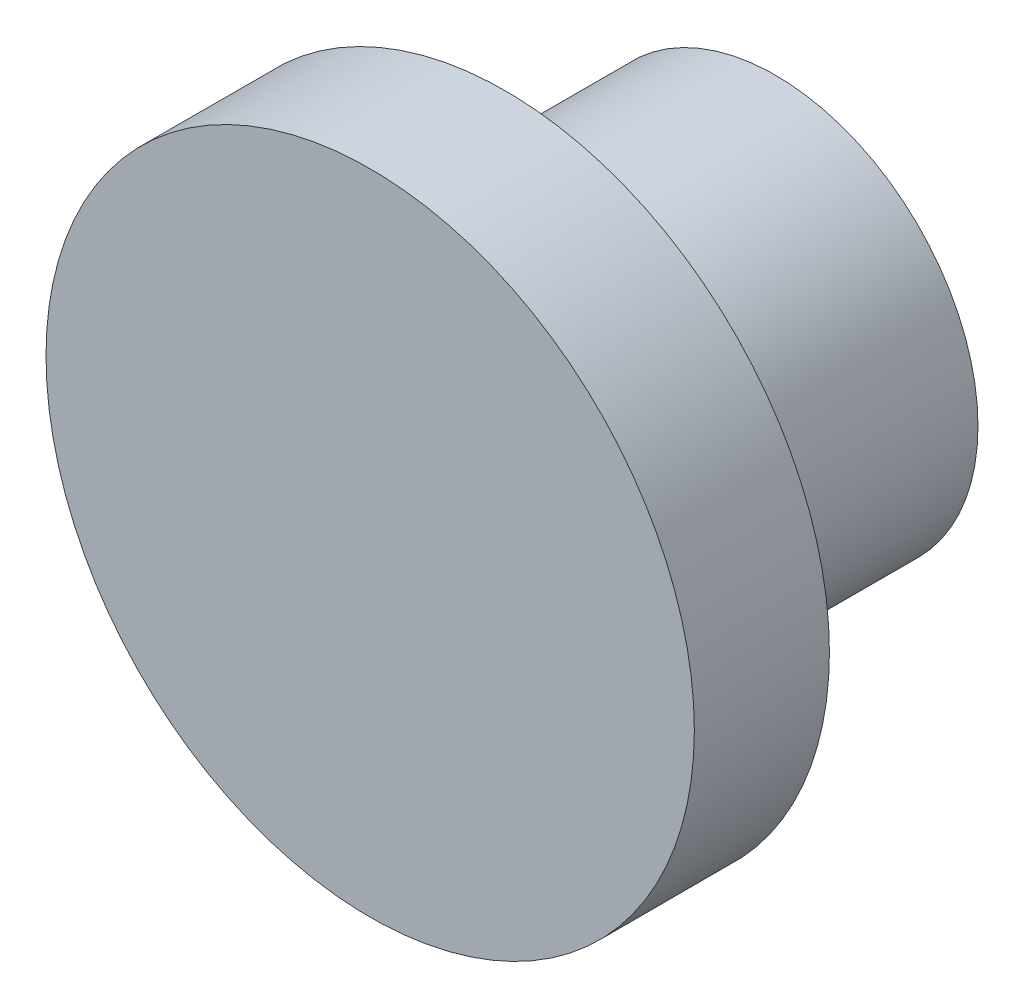
ISO-10303-21;
HEADER;
FILE_DESCRIPTION(('STEP AP214'),'2;1');
FILE_NAME('part.step','',(''),(''),'','','');
FILE_SCHEMA(('AUTOMOTIVE_DESIGN { 1 0 10303 214 1 1 1 1 }'));
ENDSEC;
DATA;
#1=APPLICATION_CONTEXT('core data for automotive mechanical design processes');
#2=APPLICATION_PROTOCOL_DEFINITION('international standard','automotive_design',2000,#1);
#3=PRODUCT_CONTEXT('',#1,'mechanical');
#4=PRODUCT('Part','Part','',(#3));
#5=PRODUCT_RELATED_PRODUCT_CATEGORY('part','',(#4));
#6=PRODUCT_DEFINITION_FORMATION('','',#4);
#7=PRODUCT_DEFINITION_CONTEXT('part definition',#1,'design');
#8=PRODUCT_DEFINITION('design','',#6,#7);
#9=PRODUCT_DEFINITION_SHAPE('','',#8);
#10=(LENGTH_UNIT() NAMED_UNIT(*) SI_UNIT(.MILLI.,.METRE.));
#11=(NAMED_UNIT(*) PLANE_ANGLE_UNIT() SI_UNIT($,.RADIAN.));
#12=(NAMED_UNIT(*) SI_UNIT($,.STERADIAN.) SOLID_ANGLE_UNIT());
#13=UNCERTAINTY_MEASURE_WITH_UNIT(LENGTH_MEASURE(1.E-05),#10,'distance_accuracy_value','');
#14=(GEOMETRIC_REPRESENTATION_CONTEXT(3) GLOBAL_UNCERTAINTY_ASSIGNED_CONTEXT((#13)) GLOBAL_UNIT_ASSIGNED_CONTEXT((#10,
#11,#12)) REPRESENTATION_CONTEXT('',''));
#15=CARTESIAN_POINT('',(0.,0.,0.));
#16=DIRECTION('',(0.,0.,1.));
#17=DIRECTION('',(1.,0.,0.));
#18=AXIS2_PLACEMENT_3D('',#15,#16,#17);
#19=CARTESIAN_POINT('',(0.,30.,92.4264068711929));
#20=DIRECTION('',(0.,0.,-1.));
#21=DIRECTION('',(-1.,0.,0.));
#22=AXIS2_PLACEMENT_3D('',#19,#20,#21);
#23=CYLINDRICAL_SURFACE('',#22,15.);
#24=CARTESIAN_POINT('',(0.,30.,20.));
#25=DIRECTION('',(0.,0.,1.));
#26=DIRECTION('',(1.,0.,0.));
#27=AXIS2_PLACEMENT_3D('',#24,#25,#26);
#28=CIRCLE('',#27,15.);
#29=CARTESIAN_POINT('',(15.,30.,20.));
#30=VERTEX_POINT('',#29);
#31=EDGE_CURVE('E21',#30,#30,#28,.T.);
#32=ORIENTED_EDGE('',*,*,#31,.T.);
#33=EDGE_LOOP('',(#32));
#34=FACE_BOUND('',#33,.T.);
#35=CARTESIAN_POINT('',(0.,30.,40.));
#36=DIRECTION('',(0.,0.,1.));
#37=DIRECTION('',(0.,-1.,0.));
#38=AXIS2_PLACEMENT_3D('',#35,#36,#37);
#39=CIRCLE('',#38,15.);
#40=CARTESIAN_POINT('',(0.,15.,40.));
#41=VERTEX_POINT('',#40);
#42=EDGE_CURVE('E10',#41,#41,#39,.T.);
#43=ORIENTED_EDGE('',*,*,#42,.F.);
#44=EDGE_LOOP('',(#43));
#45=FACE_BOUND('',#44,.T.);
#46=ADVANCED_FACE('F15',(#34,#45),#23,.T.);
#47=CARTESIAN_POINT('',(0.,30.,20.));
#48=DIRECTION('',(0.,0.,1.));
#49=DIRECTION('',(1.,0.,0.));
#50=AXIS2_PLACEMENT_3D('',#47,#48,#49);
#51=PLANE('',#50);
#52=ORIENTED_EDGE('',*,*,#31,.F.);
#53=EDGE_LOOP('',(#52));
#54=FACE_BOUND('',#53,.T.);
#55=ADVANCED_FACE('F40',(#54),#51,.F.);
#56=CARTESIAN_POINT('',(0.,30.,-27.8822509939086));
#57=DIRECTION('',(0.,0.,1.));
#58=DIRECTION('',(1.,0.,0.));
#59=AXIS2_PLACEMENT_3D('',#56,#57,#58);
#60=CYLINDRICAL_SURFACE('',#59,24.);
#61=CARTESIAN_POINT('',(0.,30.,40.));
#62=DIRECTION('',(0.,0.,1.));
#63=DIRECTION('',(0.,-1.,0.));
#64=AXIS2_PLACEMENT_3D('',#61,#62,#63);
#65=CIRCLE('',#64,24.);
#66=CARTESIAN_POINT('',(0.,6.,40.));
#67=VERTEX_POINT('',#66);
#68=EDGE_CURVE('E25',#67,#67,#65,.F.);
#69=ORIENTED_EDGE('',*,*,#68,.F.);
#70=EDGE_LOOP('',(#69));
#71=FACE_BOUND('',#70,.T.);
#72=CARTESIAN_POINT('',(0.,30.,50.));
#73=DIRECTION('',(0.,0.,1.));
#74=DIRECTION('',(1.,0.,0.));
#75=AXIS2_PLACEMENT_3D('',#72,#73,#74);
#76=CIRCLE('',#75,24.);
#77=CARTESIAN_POINT('',(24.,30.,50.));
#78=VERTEX_POINT('',#77);
#79=EDGE_CURVE('E29',#78,#78,#76,.T.);
#80=ORIENTED_EDGE('',*,*,#79,.F.);
#81=EDGE_LOOP('',(#80));
#82=FACE_BOUND('',#81,.T.);
#83=ADVANCED_FACE('F37',(#71,#82),#60,.T.);
#84=CARTESIAN_POINT('',(0.,30.,40.));
#85=DIRECTION('',(0.,0.,1.));
#86=DIRECTION('',(0.,-1.,0.));
#87=AXIS2_PLACEMENT_3D('',#84,#85,#86);
#88=PLANE('',#87);
#89=ORIENTED_EDGE('',*,*,#42,.T.);
#90=EDGE_LOOP('',(#89));
#91=FACE_BOUND('',#90,.T.);
#92=ORIENTED_EDGE('',*,*,#68,.T.);
#93=EDGE_LOOP('',(#92));
#94=FACE_BOUND('',#93,.T.);
#95=ADVANCED_FACE('F39',(#91,#94),#88,.F.);
#96=CARTESIAN_POINT('',(50.,75.,50.));
#97=DIRECTION('',(0.,0.,-1.));
#98=DIRECTION('',(0.,1.,0.));
#99=AXIS2_PLACEMENT_3D('',#96,#97,#98);
#100=PLANE('',#99);
#101=ORIENTED_EDGE('',*,*,#79,.T.);
#102=EDGE_LOOP('',(#101));
#103=FACE_BOUND('',#102,.T.);
#104=ADVANCED_FACE('F35',(#103),#100,.F.);
#105=CLOSED_SHELL('',(#46,#55,#83,#95,#104));
#106=MANIFOLD_SOLID_BREP('B1',#105);
#107=ADVANCED_BREP_SHAPE_REPRESENTATION('',(#18,#106),#14);
#108=SHAPE_DEFINITION_REPRESENTATION(#9,#107);
ENDSEC;
END-ISO-10303-21;
